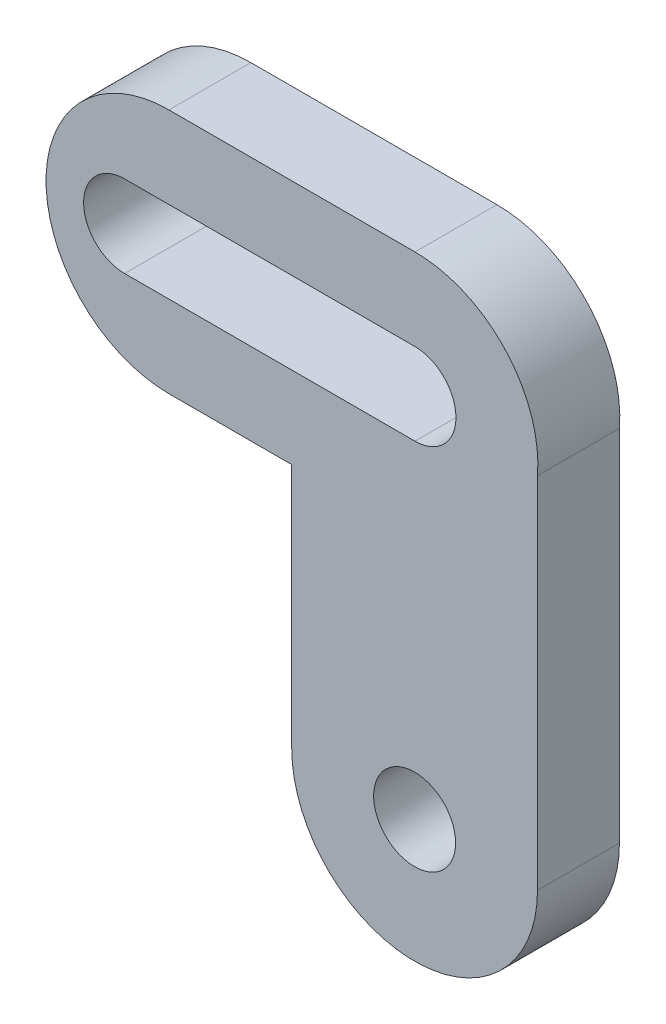
ISO-10303-21;
HEADER;
FILE_DESCRIPTION(('STEP AP214'),'2;1');
FILE_NAME('part.step','',(''),(''),'','','');
FILE_SCHEMA(('AUTOMOTIVE_DESIGN { 1 0 10303 214 1 1 1 1 }'));
ENDSEC;
DATA;
#1=APPLICATION_CONTEXT('core data for automotive mechanical design processes');
#2=APPLICATION_PROTOCOL_DEFINITION('international standard','automotive_design',2000,#1);
#3=PRODUCT_CONTEXT('',#1,'mechanical');
#4=PRODUCT('Part','Part','',(#3));
#5=PRODUCT_RELATED_PRODUCT_CATEGORY('part','',(#4));
#6=PRODUCT_DEFINITION_FORMATION('','',#4);
#7=PRODUCT_DEFINITION_CONTEXT('part definition',#1,'design');
#8=PRODUCT_DEFINITION('design','',#6,#7);
#9=PRODUCT_DEFINITION_SHAPE('','',#8);
#10=(LENGTH_UNIT() NAMED_UNIT(*) SI_UNIT(.MILLI.,.METRE.));
#11=(NAMED_UNIT(*) PLANE_ANGLE_UNIT() SI_UNIT($,.RADIAN.));
#12=(NAMED_UNIT(*) SI_UNIT($,.STERADIAN.) SOLID_ANGLE_UNIT());
#13=UNCERTAINTY_MEASURE_WITH_UNIT(LENGTH_MEASURE(1.E-05),#10,'distance_accuracy_value','');
#14=(GEOMETRIC_REPRESENTATION_CONTEXT(3) GLOBAL_UNCERTAINTY_ASSIGNED_CONTEXT((#13)) GLOBAL_UNIT_ASSIGNED_CONTEXT((#10,
#11,#12)) REPRESENTATION_CONTEXT('',''));
#15=CARTESIAN_POINT('',(0.,0.,0.));
#16=DIRECTION('',(0.,0.,1.));
#17=DIRECTION('',(1.,0.,0.));
#18=AXIS2_PLACEMENT_3D('',#15,#16,#17);
#19=CARTESIAN_POINT('',(180.8549532214,220.7512286528,3.));
#20=DIRECTION('',(0.,0.,-1.));
#21=DIRECTION('',(-1.,0.,0.));
#22=AXIS2_PLACEMENT_3D('',#19,#20,#21);
#23=CYLINDRICAL_SURFACE('',#22,1.5);
#24=CARTESIAN_POINT('',(180.8549532214,220.7512286528,0.));
#25=DIRECTION('',(0.,0.,1.));
#26=DIRECTION('',(1.,0.,0.));
#27=AXIS2_PLACEMENT_3D('',#24,#25,#26);
#28=CIRCLE('',#27,1.5);
#29=CARTESIAN_POINT('',(180.8549532214,219.2512286528,0.));
#30=VERTEX_POINT('',#29);
#31=CARTESIAN_POINT('',(180.8549532214,222.2512286528,0.));
#32=VERTEX_POINT('',#31);
#33=EDGE_CURVE('E172',#30,#32,#28,.T.);
#34=ORIENTED_EDGE('',*,*,#33,.F.);
#35=DIRECTION('',(0.,0.,-1.));
#36=VECTOR('',#35,1.);
#37=CARTESIAN_POINT('',(180.8549532214,219.2512286528,3.));
#38=LINE('',#37,#36);
#39=CARTESIAN_POINT('',(180.8549532214,219.2512286528,3.));
#40=VERTEX_POINT('',#39);
#41=EDGE_CURVE('E11',#40,#30,#38,.T.);
#42=ORIENTED_EDGE('',*,*,#41,.F.);
#43=CARTESIAN_POINT('',(180.8549532214,220.7512286528,3.));
#44=DIRECTION('',(0.,0.,1.));
#45=DIRECTION('',(1.,0.,0.));
#46=AXIS2_PLACEMENT_3D('',#43,#44,#45);
#47=CIRCLE('',#46,1.5);
#48=CARTESIAN_POINT('',(180.8549532214,222.2512286528,3.));
#49=VERTEX_POINT('',#48);
#50=EDGE_CURVE('E140',#40,#49,#47,.T.);
#51=ORIENTED_EDGE('',*,*,#50,.T.);
#52=DIRECTION('',(0.,0.,-1.));
#53=VECTOR('',#52,1.);
#54=CARTESIAN_POINT('',(180.8549532214,222.2512286528,3.));
#55=LINE('',#54,#53);
#56=EDGE_CURVE('E95',#49,#32,#55,.T.);
#57=ORIENTED_EDGE('',*,*,#56,.T.);
#58=EDGE_LOOP('',(#34,#42,#51,#57));
#59=FACE_BOUND('',#58,.T.);
#60=ADVANCED_FACE('F33',(#59),#23,.F.);
#61=CARTESIAN_POINT('',(0.,219.2512286528,3.));
#62=DIRECTION('',(0.,1.,0.));
#63=DIRECTION('',(0.,0.,1.));
#64=AXIS2_PLACEMENT_3D('',#61,#62,#63);
#65=PLANE('',#64);
#66=DIRECTION('',(1.,0.,0.));
#67=VECTOR('',#66,1.);
#68=CARTESIAN_POINT('',(0.,219.2512286528,0.));
#69=LINE('',#68,#67);
#70=CARTESIAN_POINT('',(170.2199532214,219.2512286528,0.));
#71=VERTEX_POINT('',#70);
#72=EDGE_CURVE('E131',#71,#30,#69,.T.);
#73=ORIENTED_EDGE('',*,*,#72,.F.);
#74=DIRECTION('',(0.,0.,-1.));
#75=VECTOR('',#74,1.);
#76=CARTESIAN_POINT('',(170.2199532214,219.2512286528,3.));
#77=LINE('',#76,#75);
#78=CARTESIAN_POINT('',(170.2199532214,219.2512286528,3.));
#79=VERTEX_POINT('',#78);
#80=EDGE_CURVE('E43',#79,#71,#77,.T.);
#81=ORIENTED_EDGE('',*,*,#80,.F.);
#82=DIRECTION('',(1.,0.,0.));
#83=VECTOR('',#82,1.);
#84=CARTESIAN_POINT('',(0.,219.2512286528,3.));
#85=LINE('',#84,#83);
#86=EDGE_CURVE('E129',#79,#40,#85,.T.);
#87=ORIENTED_EDGE('',*,*,#86,.T.);
#88=ORIENTED_EDGE('',*,*,#41,.T.);
#89=EDGE_LOOP('',(#73,#81,#87,#88));
#90=FACE_BOUND('',#89,.T.);
#91=ADVANCED_FACE('F128',(#90),#65,.T.);
#92=CARTESIAN_POINT('',(170.2199532214,220.7512286528,3.));
#93=DIRECTION('',(0.,0.,-1.));
#94=DIRECTION('',(-1.,0.,0.));
#95=AXIS2_PLACEMENT_3D('',#92,#93,#94);
#96=CYLINDRICAL_SURFACE('',#95,1.5);
#97=CARTESIAN_POINT('',(170.2199532214,220.7512286528,0.));
#98=DIRECTION('',(0.,0.,1.));
#99=DIRECTION('',(1.,0.,0.));
#100=AXIS2_PLACEMENT_3D('',#97,#98,#99);
#101=CIRCLE('',#100,1.5);
#102=CARTESIAN_POINT('',(170.2199532214,222.2512286528,0.));
#103=VERTEX_POINT('',#102);
#104=EDGE_CURVE('E176',#103,#71,#101,.T.);
#105=ORIENTED_EDGE('',*,*,#104,.F.);
#106=DIRECTION('',(0.,0.,-1.));
#107=VECTOR('',#106,1.);
#108=CARTESIAN_POINT('',(170.2199532214,222.2512286528,3.));
#109=LINE('',#108,#107);
#110=CARTESIAN_POINT('',(170.2199532214,222.2512286528,3.));
#111=VERTEX_POINT('',#110);
#112=EDGE_CURVE('E88',#111,#103,#109,.T.);
#113=ORIENTED_EDGE('',*,*,#112,.F.);
#114=CARTESIAN_POINT('',(170.2199532214,220.7512286528,3.));
#115=DIRECTION('',(0.,0.,1.));
#116=DIRECTION('',(1.,0.,0.));
#117=AXIS2_PLACEMENT_3D('',#114,#115,#116);
#118=CIRCLE('',#117,1.5);
#119=EDGE_CURVE('E139',#111,#79,#118,.T.);
#120=ORIENTED_EDGE('',*,*,#119,.T.);
#121=ORIENTED_EDGE('',*,*,#80,.T.);
#122=EDGE_LOOP('',(#105,#113,#120,#121));
#123=FACE_BOUND('',#122,.T.);
#124=ADVANCED_FACE('F142',(#123),#96,.F.);
#125=CARTESIAN_POINT('',(185.3409928876,0.,3.));
#126=DIRECTION('',(1.,0.,0.));
#127=DIRECTION('',(0.,0.,-1.));
#128=AXIS2_PLACEMENT_3D('',#125,#126,#127);
#129=PLANE('',#128);
#130=DIRECTION('',(0.,-1.,0.));
#131=VECTOR('',#130,1.);
#132=CARTESIAN_POINT('',(185.3409928876,0.,0.));
#133=LINE('',#132,#131);
#134=CARTESIAN_POINT('',(185.3409928876,220.397042101277,0.));
#135=VERTEX_POINT('',#134);
#136=CARTESIAN_POINT('',(185.3409928876,207.2512286528,0.));
#137=VERTEX_POINT('',#136);
#138=EDGE_CURVE('E151',#135,#137,#133,.T.);
#139=ORIENTED_EDGE('',*,*,#138,.F.);
#140=DIRECTION('',(0.,0.,-1.));
#141=VECTOR('',#140,1.);
#142=CARTESIAN_POINT('',(185.3409928876,220.397042101277,3.));
#143=LINE('',#142,#141);
#144=CARTESIAN_POINT('',(185.3409928876,220.397042101277,3.));
#145=VERTEX_POINT('',#144);
#146=EDGE_CURVE('E37',#145,#135,#143,.T.);
#147=ORIENTED_EDGE('',*,*,#146,.F.);
#148=DIRECTION('',(0.,-1.,0.));
#149=VECTOR('',#148,1.);
#150=CARTESIAN_POINT('',(185.3409928876,0.,3.));
#151=LINE('',#150,#149);
#152=CARTESIAN_POINT('',(185.3409928876,207.2512286528,3.));
#153=VERTEX_POINT('',#152);
#154=EDGE_CURVE('E183',#145,#153,#151,.T.);
#155=ORIENTED_EDGE('',*,*,#154,.T.);
#156=DIRECTION('',(0.,0.,-1.));
#157=VECTOR('',#156,1.);
#158=CARTESIAN_POINT('',(185.3409928876,207.2512286528,3.));
#159=LINE('',#158,#157);
#160=EDGE_CURVE('E150',#153,#137,#159,.T.);
#161=ORIENTED_EDGE('',*,*,#160,.T.);
#162=EDGE_LOOP('',(#139,#147,#155,#161));
#163=FACE_BOUND('',#162,.T.);
#164=ADVANCED_FACE('F35',(#163),#129,.T.);
#165=CARTESIAN_POINT('',(180.8549532214,220.7512286528,3.));
#166=DIRECTION('',(0.,0.,-1.));
#167=DIRECTION('',(-1.,0.,0.));
#168=AXIS2_PLACEMENT_3D('',#165,#166,#167);
#169=CYLINDRICAL_SURFACE('',#168,4.5);
#170=CARTESIAN_POINT('',(180.8549532214,220.7512286528,0.));
#171=DIRECTION('',(0.,0.,1.));
#172=DIRECTION('',(1.,0.,0.));
#173=AXIS2_PLACEMENT_3D('',#170,#171,#172);
#174=CIRCLE('',#173,4.5);
#175=CARTESIAN_POINT('',(180.8549532214,225.2512286528,0.));
#176=VERTEX_POINT('',#175);
#177=EDGE_CURVE('E154',#135,#176,#174,.T.);
#178=ORIENTED_EDGE('',*,*,#177,.T.);
#179=DIRECTION('',(0.,0.,-1.));
#180=VECTOR('',#179,1.);
#181=CARTESIAN_POINT('',(180.8549532214,225.2512286528,3.));
#182=LINE('',#181,#180);
#183=CARTESIAN_POINT('',(180.8549532214,225.2512286528,3.));
#184=VERTEX_POINT('',#183);
#185=EDGE_CURVE('E194',#184,#176,#182,.T.);
#186=ORIENTED_EDGE('',*,*,#185,.F.);
#187=CARTESIAN_POINT('',(180.8549532214,220.7512286528,3.));
#188=DIRECTION('',(0.,0.,1.));
#189=DIRECTION('',(1.,0.,0.));
#190=AXIS2_PLACEMENT_3D('',#187,#188,#189);
#191=CIRCLE('',#190,4.5);
#192=EDGE_CURVE('E202',#145,#184,#191,.T.);
#193=ORIENTED_EDGE('',*,*,#192,.F.);
#194=ORIENTED_EDGE('',*,*,#146,.T.);
#195=EDGE_LOOP('',(#178,#186,#193,#194));
#196=FACE_BOUND('',#195,.T.);
#197=ADVANCED_FACE('F201',(#196),#169,.T.);
#198=CARTESIAN_POINT('',(0.,225.2512286528,3.));
#199=DIRECTION('',(0.,1.,0.));
#200=DIRECTION('',(0.,0.,1.));
#201=AXIS2_PLACEMENT_3D('',#198,#199,#200);
#202=PLANE('',#201);
#203=DIRECTION('',(1.,0.,0.));
#204=VECTOR('',#203,1.);
#205=CARTESIAN_POINT('',(0.,225.2512286528,0.));
#206=LINE('',#205,#204);
#207=CARTESIAN_POINT('',(171.8449532214,225.2512286528,0.));
#208=VERTEX_POINT('',#207);
#209=EDGE_CURVE('E157',#208,#176,#206,.T.);
#210=ORIENTED_EDGE('',*,*,#209,.F.);
#211=DIRECTION('',(0.,0.,-1.));
#212=VECTOR('',#211,1.);
#213=CARTESIAN_POINT('',(171.8449532214,225.2512286528,3.));
#214=LINE('',#213,#212);
#215=CARTESIAN_POINT('',(171.8449532214,225.2512286528,3.));
#216=VERTEX_POINT('',#215);
#217=EDGE_CURVE('E193',#216,#208,#214,.T.);
#218=ORIENTED_EDGE('',*,*,#217,.F.);
#219=DIRECTION('',(1.,0.,0.));
#220=VECTOR('',#219,1.);
#221=CARTESIAN_POINT('',(0.,225.2512286528,3.));
#222=LINE('',#221,#220);
#223=EDGE_CURVE('E229',#216,#184,#222,.T.);
#224=ORIENTED_EDGE('',*,*,#223,.T.);
#225=ORIENTED_EDGE('',*,*,#185,.T.);
#226=EDGE_LOOP('',(#210,#218,#224,#225));
#227=FACE_BOUND('',#226,.T.);
#228=ADVANCED_FACE('F226',(#227),#202,.T.);
#229=CARTESIAN_POINT('',(171.8449532214,220.7512286528,3.));
#230=DIRECTION('',(0.,0.,-1.));
#231=DIRECTION('',(-1.,0.,0.));
#232=AXIS2_PLACEMENT_3D('',#229,#230,#231);
#233=CYLINDRICAL_SURFACE('',#232,4.5);
#234=CARTESIAN_POINT('',(171.8449532214,220.7512286528,0.));
#235=DIRECTION('',(0.,0.,1.));
#236=DIRECTION('',(1.,0.,0.));
#237=AXIS2_PLACEMENT_3D('',#234,#235,#236);
#238=CIRCLE('',#237,4.5);
#239=CARTESIAN_POINT('',(171.8449532214,216.2512286528,0.));
#240=VERTEX_POINT('',#239);
#241=EDGE_CURVE('E160',#208,#240,#238,.T.);
#242=ORIENTED_EDGE('',*,*,#241,.T.);
#243=DIRECTION('',(0.,0.,-1.));
#244=VECTOR('',#243,1.);
#245=CARTESIAN_POINT('',(171.8449532214,216.2512286528,3.));
#246=LINE('',#245,#244);
#247=CARTESIAN_POINT('',(171.8449532214,216.2512286528,3.));
#248=VERTEX_POINT('',#247);
#249=EDGE_CURVE('E191',#248,#240,#246,.T.);
#250=ORIENTED_EDGE('',*,*,#249,.F.);
#251=CARTESIAN_POINT('',(171.8449532214,220.7512286528,3.));
#252=DIRECTION('',(0.,0.,1.));
#253=DIRECTION('',(1.,0.,0.));
#254=AXIS2_PLACEMENT_3D('',#251,#252,#253);
#255=CIRCLE('',#254,4.5);
#256=EDGE_CURVE('E230',#216,#248,#255,.T.);
#257=ORIENTED_EDGE('',*,*,#256,.F.);
#258=ORIENTED_EDGE('',*,*,#217,.T.);
#259=EDGE_LOOP('',(#242,#250,#257,#258));
#260=FACE_BOUND('',#259,.T.);
#261=ADVANCED_FACE('F231',(#260),#233,.T.);
#262=CARTESIAN_POINT('',(0.,216.2512286528,3.));
#263=DIRECTION('',(0.,-1.,0.));
#264=DIRECTION('',(0.,0.,-1.));
#265=AXIS2_PLACEMENT_3D('',#262,#263,#264);
#266=PLANE('',#265);
#267=DIRECTION('',(-1.,0.,0.));
#268=VECTOR('',#267,1.);
#269=CARTESIAN_POINT('',(0.,216.2512286528,0.));
#270=LINE('',#269,#268);
#271=CARTESIAN_POINT('',(176.3409928876,216.2512286528,0.));
#272=VERTEX_POINT('',#271);
#273=EDGE_CURVE('E163',#272,#240,#270,.T.);
#274=ORIENTED_EDGE('',*,*,#273,.F.);
#275=DIRECTION('',(0.,0.,-1.));
#276=VECTOR('',#275,1.);
#277=CARTESIAN_POINT('',(176.3409928876,216.2512286528,3.));
#278=LINE('',#277,#276);
#279=CARTESIAN_POINT('',(176.3409928876,216.2512286528,3.));
#280=VERTEX_POINT('',#279);
#281=EDGE_CURVE('E189',#280,#272,#278,.T.);
#282=ORIENTED_EDGE('',*,*,#281,.F.);
#283=DIRECTION('',(-1.,0.,0.));
#284=VECTOR('',#283,1.);
#285=CARTESIAN_POINT('',(0.,216.2512286528,3.));
#286=LINE('',#285,#284);
#287=EDGE_CURVE('E233',#280,#248,#286,.T.);
#288=ORIENTED_EDGE('',*,*,#287,.T.);
#289=ORIENTED_EDGE('',*,*,#249,.T.);
#290=EDGE_LOOP('',(#274,#282,#288,#289));
#291=FACE_BOUND('',#290,.T.);
#292=ADVANCED_FACE('F223',(#291),#266,.T.);
#293=CARTESIAN_POINT('',(176.3409928876,0.,3.));
#294=DIRECTION('',(-1.,0.,0.));
#295=DIRECTION('',(0.,0.,1.));
#296=AXIS2_PLACEMENT_3D('',#293,#294,#295);
#297=PLANE('',#296);
#298=DIRECTION('',(0.,1.,0.));
#299=VECTOR('',#298,1.);
#300=CARTESIAN_POINT('',(176.3409928876,0.,0.));
#301=LINE('',#300,#299);
#302=CARTESIAN_POINT('',(176.3409928876,207.2512286528,0.));
#303=VERTEX_POINT('',#302);
#304=EDGE_CURVE('E166',#303,#272,#301,.T.);
#305=ORIENTED_EDGE('',*,*,#304,.F.);
#306=DIRECTION('',(0.,0.,-1.));
#307=VECTOR('',#306,1.);
#308=CARTESIAN_POINT('',(176.3409928876,207.2512286528,3.));
#309=LINE('',#308,#307);
#310=CARTESIAN_POINT('',(176.3409928876,207.2512286528,3.));
#311=VERTEX_POINT('',#310);
#312=EDGE_CURVE('E187',#311,#303,#309,.T.);
#313=ORIENTED_EDGE('',*,*,#312,.F.);
#314=DIRECTION('',(0.,1.,0.));
#315=VECTOR('',#314,1.);
#316=CARTESIAN_POINT('',(176.3409928876,0.,3.));
#317=LINE('',#316,#315);
#318=EDGE_CURVE('E219',#311,#280,#317,.T.);
#319=ORIENTED_EDGE('',*,*,#318,.T.);
#320=ORIENTED_EDGE('',*,*,#281,.T.);
#321=EDGE_LOOP('',(#305,#313,#319,#320));
#322=FACE_BOUND('',#321,.T.);
#323=ADVANCED_FACE('F215',(#322),#297,.T.);
#324=CARTESIAN_POINT('',(0.,222.2512286528,3.));
#325=DIRECTION('',(0.,1.,0.));
#326=DIRECTION('',(0.,0.,1.));
#327=AXIS2_PLACEMENT_3D('',#324,#325,#326);
#328=PLANE('',#327);
#329=DIRECTION('',(1.,0.,0.));
#330=VECTOR('',#329,1.);
#331=CARTESIAN_POINT('',(0.,222.2512286528,0.));
#332=LINE('',#331,#330);
#333=EDGE_CURVE('E178',#103,#32,#332,.T.);
#334=ORIENTED_EDGE('',*,*,#333,.T.);
#335=ORIENTED_EDGE('',*,*,#56,.F.);
#336=DIRECTION('',(1.,0.,0.));
#337=VECTOR('',#336,1.);
#338=CARTESIAN_POINT('',(0.,222.2512286528,3.));
#339=LINE('',#338,#337);
#340=EDGE_CURVE('E52',#111,#49,#339,.T.);
#341=ORIENTED_EDGE('',*,*,#340,.F.);
#342=ORIENTED_EDGE('',*,*,#112,.T.);
#343=EDGE_LOOP('',(#334,#335,#341,#342));
#344=FACE_BOUND('',#343,.T.);
#345=ADVANCED_FACE('F243',(#344),#328,.F.);
#346=CARTESIAN_POINT('',(180.8409928876,207.2512286528,3.));
#347=DIRECTION('',(0.,0.,-1.));
#348=DIRECTION('',(-1.,0.,0.));
#349=AXIS2_PLACEMENT_3D('',#346,#347,#348);
#350=CYLINDRICAL_SURFACE('',#349,4.49999999999999);
#351=CARTESIAN_POINT('',(180.8409928876,207.2512286528,0.));
#352=DIRECTION('',(0.,0.,1.));
#353=DIRECTION('',(1.,0.,0.));
#354=AXIS2_PLACEMENT_3D('',#351,#352,#353);
#355=CIRCLE('',#354,4.49999999999999);
#356=EDGE_CURVE('E169',#303,#137,#355,.T.);
#357=ORIENTED_EDGE('',*,*,#356,.T.);
#358=ORIENTED_EDGE('',*,*,#160,.F.);
#359=CARTESIAN_POINT('',(180.8409928876,207.2512286528,3.));
#360=DIRECTION('',(0.,0.,1.));
#361=DIRECTION('',(1.,0.,0.));
#362=AXIS2_PLACEMENT_3D('',#359,#360,#361);
#363=CIRCLE('',#362,4.49999999999999);
#364=EDGE_CURVE('E241',#311,#153,#363,.T.);
#365=ORIENTED_EDGE('',*,*,#364,.F.);
#366=ORIENTED_EDGE('',*,*,#312,.T.);
#367=EDGE_LOOP('',(#357,#358,#365,#366));
#368=FACE_BOUND('',#367,.T.);
#369=ADVANCED_FACE('F212',(#368),#350,.T.);
#370=CARTESIAN_POINT('',(180.8409928876,207.2512286528,3.));
#371=DIRECTION('',(0.,0.,-1.));
#372=DIRECTION('',(-1.,0.,0.));
#373=AXIS2_PLACEMENT_3D('',#370,#371,#372);
#374=CYLINDRICAL_SURFACE('',#373,1.5);
#375=CARTESIAN_POINT('',(180.8409928876,207.2512286528,3.));
#376=DIRECTION('',(0.,0.,1.));
#377=DIRECTION('',(1.,0.,0.));
#378=AXIS2_PLACEMENT_3D('',#375,#376,#377);
#379=CIRCLE('',#378,1.5);
#380=CARTESIAN_POINT('',(182.3409928876,207.2512286528,3.));
#381=VERTEX_POINT('',#380);
#382=EDGE_CURVE('E144',#381,#381,#379,.T.);
#383=ORIENTED_EDGE('',*,*,#382,.T.);
#384=EDGE_LOOP('',(#383));
#385=FACE_BOUND('',#384,.T.);
#386=CARTESIAN_POINT('',(180.8409928876,207.2512286528,0.));
#387=DIRECTION('',(0.,0.,1.));
#388=DIRECTION('',(1.,0.,0.));
#389=AXIS2_PLACEMENT_3D('',#386,#387,#388);
#390=CIRCLE('',#389,1.5);
#391=CARTESIAN_POINT('',(182.3409928876,207.2512286528,0.));
#392=VERTEX_POINT('',#391);
#393=EDGE_CURVE('E180',#392,#392,#390,.T.);
#394=ORIENTED_EDGE('',*,*,#393,.F.);
#395=EDGE_LOOP('',(#394));
#396=FACE_BOUND('',#395,.T.);
#397=ADVANCED_FACE('F250',(#385,#396),#374,.F.);
#398=CARTESIAN_POINT('',(0.,0.,3.));
#399=DIRECTION('',(0.,0.,1.));
#400=DIRECTION('',(1.,0.,0.));
#401=AXIS2_PLACEMENT_3D('',#398,#399,#400);
#402=PLANE('',#401);
#403=ORIENTED_EDGE('',*,*,#154,.F.);
#404=ORIENTED_EDGE('',*,*,#192,.T.);
#405=ORIENTED_EDGE('',*,*,#223,.F.);
#406=ORIENTED_EDGE('',*,*,#256,.T.);
#407=ORIENTED_EDGE('',*,*,#287,.F.);
#408=ORIENTED_EDGE('',*,*,#318,.F.);
#409=ORIENTED_EDGE('',*,*,#364,.T.);
#410=EDGE_LOOP('',(#403,#404,#405,#406,#407,#408,#409));
#411=FACE_BOUND('',#410,.T.);
#412=ORIENTED_EDGE('',*,*,#50,.F.);
#413=ORIENTED_EDGE('',*,*,#86,.F.);
#414=ORIENTED_EDGE('',*,*,#119,.F.);
#415=ORIENTED_EDGE('',*,*,#340,.T.);
#416=EDGE_LOOP('',(#412,#413,#414,#415));
#417=FACE_BOUND('',#416,.T.);
#418=ORIENTED_EDGE('',*,*,#382,.F.);
#419=EDGE_LOOP('',(#418));
#420=FACE_BOUND('',#419,.T.);
#421=ADVANCED_FACE('F137',(#411,#417,#420),#402,.T.);
#422=CARTESIAN_POINT('',(0.,0.,0.));
#423=DIRECTION('',(0.,0.,1.));
#424=DIRECTION('',(1.,0.,0.));
#425=AXIS2_PLACEMENT_3D('',#422,#423,#424);
#426=PLANE('',#425);
#427=ORIENTED_EDGE('',*,*,#138,.T.);
#428=ORIENTED_EDGE('',*,*,#356,.F.);
#429=ORIENTED_EDGE('',*,*,#304,.T.);
#430=ORIENTED_EDGE('',*,*,#273,.T.);
#431=ORIENTED_EDGE('',*,*,#241,.F.);
#432=ORIENTED_EDGE('',*,*,#209,.T.);
#433=ORIENTED_EDGE('',*,*,#177,.F.);
#434=EDGE_LOOP('',(#427,#428,#429,#430,#431,#432,#433));
#435=FACE_BOUND('',#434,.T.);
#436=ORIENTED_EDGE('',*,*,#33,.T.);
#437=ORIENTED_EDGE('',*,*,#333,.F.);
#438=ORIENTED_EDGE('',*,*,#104,.T.);
#439=ORIENTED_EDGE('',*,*,#72,.T.);
#440=EDGE_LOOP('',(#436,#437,#438,#439));
#441=FACE_BOUND('',#440,.T.);
#442=ORIENTED_EDGE('',*,*,#393,.T.);
#443=EDGE_LOOP('',(#442));
#444=FACE_BOUND('',#443,.T.);
#445=ADVANCED_FACE('F205',(#435,#441,#444),#426,.F.);
#446=CLOSED_SHELL('',(#60,#91,#124,#164,#197,#228,#261,#292,#323,#345,#369,#397,#421,#445));
#447=MANIFOLD_SOLID_BREP('B2',#446);
#448=ADVANCED_BREP_SHAPE_REPRESENTATION('',(#18,#447),#14);
#449=SHAPE_DEFINITION_REPRESENTATION(#9,#448);
ENDSEC;
END-ISO-10303-21;
